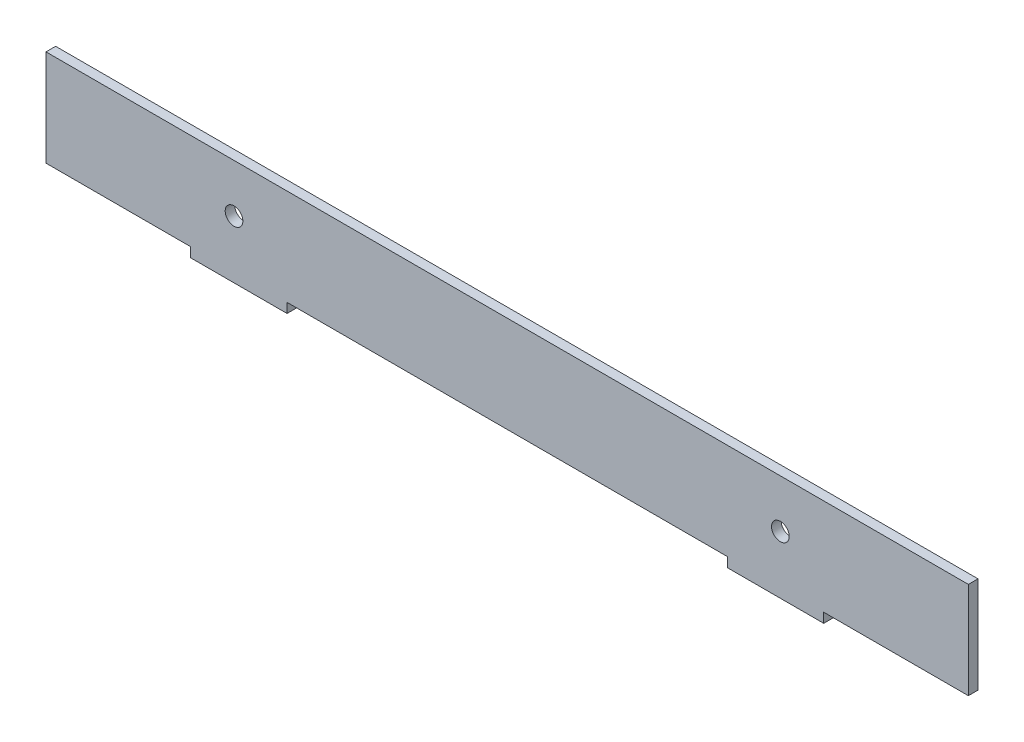
ISO-10303-21;
HEADER;
FILE_DESCRIPTION(('STEP AP214'),'2;1');
FILE_NAME('part.step','',(''),(''),'','','');
FILE_SCHEMA(('AUTOMOTIVE_DESIGN { 1 0 10303 214 1 1 1 1 }'));
ENDSEC;
DATA;
#1=APPLICATION_CONTEXT('core data for automotive mechanical design processes');
#2=APPLICATION_PROTOCOL_DEFINITION('international standard','automotive_design',2000,#1);
#3=PRODUCT_CONTEXT('',#1,'mechanical');
#4=PRODUCT('Part','Part','',(#3));
#5=PRODUCT_RELATED_PRODUCT_CATEGORY('part','',(#4));
#6=PRODUCT_DEFINITION_FORMATION('','',#4);
#7=PRODUCT_DEFINITION_CONTEXT('part definition',#1,'design');
#8=PRODUCT_DEFINITION('design','',#6,#7);
#9=PRODUCT_DEFINITION_SHAPE('','',#8);
#10=(LENGTH_UNIT() NAMED_UNIT(*) SI_UNIT(.MILLI.,.METRE.));
#11=(NAMED_UNIT(*) PLANE_ANGLE_UNIT() SI_UNIT($,.RADIAN.));
#12=(NAMED_UNIT(*) SI_UNIT($,.STERADIAN.) SOLID_ANGLE_UNIT());
#13=UNCERTAINTY_MEASURE_WITH_UNIT(LENGTH_MEASURE(1.E-05),#10,'distance_accuracy_value','');
#14=(GEOMETRIC_REPRESENTATION_CONTEXT(3) GLOBAL_UNCERTAINTY_ASSIGNED_CONTEXT((#13)) GLOBAL_UNIT_ASSIGNED_CONTEXT((#10,
#11,#12)) REPRESENTATION_CONTEXT('',''));
#15=CARTESIAN_POINT('',(0.,0.,0.));
#16=DIRECTION('',(0.,0.,1.));
#17=DIRECTION('',(1.,0.,0.));
#18=AXIS2_PLACEMENT_3D('',#15,#16,#17);
#19=CARTESIAN_POINT('',(0.,0.,-1.5));
#20=DIRECTION('',(0.,0.,-1.));
#21=DIRECTION('',(-1.,0.,0.));
#22=AXIS2_PLACEMENT_3D('',#19,#20,#21);
#23=PLANE('',#22);
#24=DIRECTION('',(0.,1.,0.));
#25=VECTOR('',#24,1.);
#26=CARTESIAN_POINT('',(143.5,-15.,-1.5));
#27=LINE('',#26,#25);
#28=CARTESIAN_POINT('',(143.5,-15.,-1.5));
#29=VERTEX_POINT('',#28);
#30=CARTESIAN_POINT('',(143.5,15.,-1.5));
#31=VERTEX_POINT('',#30);
#32=EDGE_CURVE('E154',#29,#31,#27,.T.);
#33=ORIENTED_EDGE('',*,*,#32,.F.);
#34=DIRECTION('',(1.,0.,0.));
#35=VECTOR('',#34,1.);
#36=CARTESIAN_POINT('',(98.5,-15.,-1.5));
#37=LINE('',#36,#35);
#38=CARTESIAN_POINT('',(98.5,-15.,-1.5));
#39=VERTEX_POINT('',#38);
#40=EDGE_CURVE('E97',#39,#29,#37,.T.);
#41=ORIENTED_EDGE('',*,*,#40,.F.);
#42=DIRECTION('',(0.,1.,0.));
#43=VECTOR('',#42,1.);
#44=CARTESIAN_POINT('',(98.5,-15.,-1.5));
#45=LINE('',#44,#43);
#46=CARTESIAN_POINT('',(98.5,-18.,-1.5));
#47=VERTEX_POINT('',#46);
#48=EDGE_CURVE('E91',#47,#39,#45,.T.);
#49=ORIENTED_EDGE('',*,*,#48,.F.);
#50=DIRECTION('',(1.,0.,0.));
#51=VECTOR('',#50,1.);
#52=CARTESIAN_POINT('',(98.5,-18.,-1.5));
#53=LINE('',#52,#51);
#54=CARTESIAN_POINT('',(68.5,-18.,-1.5));
#55=VERTEX_POINT('',#54);
#56=EDGE_CURVE('E144',#55,#47,#53,.T.);
#57=ORIENTED_EDGE('',*,*,#56,.F.);
#58=DIRECTION('',(0.,-1.,0.));
#59=VECTOR('',#58,1.);
#60=CARTESIAN_POINT('',(68.5,-15.,-1.5));
#61=LINE('',#60,#59);
#62=CARTESIAN_POINT('',(68.5,-15.,-1.5));
#63=VERTEX_POINT('',#62);
#64=EDGE_CURVE('E172',#63,#55,#61,.T.);
#65=ORIENTED_EDGE('',*,*,#64,.F.);
#66=DIRECTION('',(1.,0.,0.));
#67=VECTOR('',#66,1.);
#68=CARTESIAN_POINT('',(-68.5,-15.,-1.5));
#69=LINE('',#68,#67);
#70=CARTESIAN_POINT('',(-68.5,-15.,-1.5));
#71=VERTEX_POINT('',#70);
#72=EDGE_CURVE('E170',#71,#63,#69,.T.);
#73=ORIENTED_EDGE('',*,*,#72,.F.);
#74=DIRECTION('',(0.,1.,0.));
#75=VECTOR('',#74,1.);
#76=CARTESIAN_POINT('',(-68.5,-15.,-1.5));
#77=LINE('',#76,#75);
#78=CARTESIAN_POINT('',(-68.5,-18.,-1.5));
#79=VERTEX_POINT('',#78);
#80=EDGE_CURVE('E168',#79,#71,#77,.T.);
#81=ORIENTED_EDGE('',*,*,#80,.F.);
#82=DIRECTION('',(1.,0.,0.));
#83=VECTOR('',#82,1.);
#84=CARTESIAN_POINT('',(-98.5,-18.,-1.5));
#85=LINE('',#84,#83);
#86=CARTESIAN_POINT('',(-98.5,-18.,-1.5));
#87=VERTEX_POINT('',#86);
#88=EDGE_CURVE('E166',#87,#79,#85,.T.);
#89=ORIENTED_EDGE('',*,*,#88,.F.);
#90=DIRECTION('',(0.,-1.,0.));
#91=VECTOR('',#90,1.);
#92=CARTESIAN_POINT('',(-98.5,-15.,-1.5));
#93=LINE('',#92,#91);
#94=CARTESIAN_POINT('',(-98.5,-15.,-1.5));
#95=VERTEX_POINT('',#94);
#96=EDGE_CURVE('E164',#95,#87,#93,.T.);
#97=ORIENTED_EDGE('',*,*,#96,.F.);
#98=DIRECTION('',(1.,0.,0.));
#99=VECTOR('',#98,1.);
#100=CARTESIAN_POINT('',(-143.5,-15.,-1.5));
#101=LINE('',#100,#99);
#102=CARTESIAN_POINT('',(-143.5,-15.,-1.5));
#103=VERTEX_POINT('',#102);
#104=EDGE_CURVE('E162',#103,#95,#101,.T.);
#105=ORIENTED_EDGE('',*,*,#104,.F.);
#106=DIRECTION('',(0.,-1.,0.));
#107=VECTOR('',#106,1.);
#108=CARTESIAN_POINT('',(-143.5,-15.,-1.5));
#109=LINE('',#108,#107);
#110=CARTESIAN_POINT('',(-143.5,15.,-1.5));
#111=VERTEX_POINT('',#110);
#112=EDGE_CURVE('E160',#111,#103,#109,.T.);
#113=ORIENTED_EDGE('',*,*,#112,.F.);
#114=DIRECTION('',(-1.,0.,0.));
#115=VECTOR('',#114,1.);
#116=CARTESIAN_POINT('',(-143.5,15.,-1.5));
#117=LINE('',#116,#115);
#118=EDGE_CURVE('E157',#31,#111,#117,.T.);
#119=ORIENTED_EDGE('',*,*,#118,.F.);
#120=EDGE_LOOP('',(#33,#41,#49,#57,#65,#73,#81,#89,#97,#105,#113,#119));
#121=FACE_BOUND('',#120,.T.);
#122=CARTESIAN_POINT('',(85.,0.,-1.5));
#123=DIRECTION('',(0.,0.,1.));
#124=DIRECTION('',(1.,0.,0.));
#125=AXIS2_PLACEMENT_3D('',#122,#123,#124);
#126=CIRCLE('',#125,2.74999999999999);
#127=CARTESIAN_POINT('',(87.75,0.,-1.5));
#128=VERTEX_POINT('',#127);
#129=EDGE_CURVE('E158',#128,#128,#126,.T.);
#130=ORIENTED_EDGE('',*,*,#129,.T.);
#131=EDGE_LOOP('',(#130));
#132=FACE_BOUND('',#131,.T.);
#133=CARTESIAN_POINT('',(-85.,0.,-1.5));
#134=DIRECTION('',(0.,0.,1.));
#135=DIRECTION('',(1.,0.,0.));
#136=AXIS2_PLACEMENT_3D('',#133,#134,#135);
#137=CIRCLE('',#136,2.74999999999999);
#138=CARTESIAN_POINT('',(-82.25,0.,-1.5));
#139=VERTEX_POINT('',#138);
#140=EDGE_CURVE('E274',#139,#139,#137,.T.);
#141=ORIENTED_EDGE('',*,*,#140,.T.);
#142=EDGE_LOOP('',(#141));
#143=FACE_BOUND('',#142,.T.);
#144=ADVANCED_FACE('F33',(#121,#132,#143),#23,.T.);
#145=CARTESIAN_POINT('',(143.5,-15.,1.5));
#146=DIRECTION('',(-1.,0.,0.));
#147=DIRECTION('',(0.,0.,1.));
#148=AXIS2_PLACEMENT_3D('',#145,#146,#147);
#149=PLANE('',#148);
#150=ORIENTED_EDGE('',*,*,#32,.T.);
#151=DIRECTION('',(0.,0.,-1.));
#152=VECTOR('',#151,1.);
#153=CARTESIAN_POINT('',(143.5,15.,1.5));
#154=LINE('',#153,#152);
#155=CARTESIAN_POINT('',(143.5,15.,1.5));
#156=VERTEX_POINT('',#155);
#157=EDGE_CURVE('E11',#156,#31,#154,.T.);
#158=ORIENTED_EDGE('',*,*,#157,.F.);
#159=DIRECTION('',(0.,1.,0.));
#160=VECTOR('',#159,1.);
#161=CARTESIAN_POINT('',(143.5,-15.,1.5));
#162=LINE('',#161,#160);
#163=CARTESIAN_POINT('',(143.5,-15.,1.5));
#164=VERTEX_POINT('',#163);
#165=EDGE_CURVE('E177',#164,#156,#162,.T.);
#166=ORIENTED_EDGE('',*,*,#165,.F.);
#167=DIRECTION('',(0.,0.,-1.));
#168=VECTOR('',#167,1.);
#169=CARTESIAN_POINT('',(143.5,-15.,1.5));
#170=LINE('',#169,#168);
#171=EDGE_CURVE('E150',#164,#29,#170,.T.);
#172=ORIENTED_EDGE('',*,*,#171,.T.);
#173=EDGE_LOOP('',(#150,#158,#166,#172));
#174=FACE_BOUND('',#173,.T.);
#175=ADVANCED_FACE('F35',(#174),#149,.F.);
#176=CARTESIAN_POINT('',(-143.5,15.,1.5));
#177=DIRECTION('',(0.,-1.,0.));
#178=DIRECTION('',(1.,0.,0.));
#179=AXIS2_PLACEMENT_3D('',#176,#177,#178);
#180=PLANE('',#179);
#181=ORIENTED_EDGE('',*,*,#118,.T.);
#182=DIRECTION('',(0.,0.,-1.));
#183=VECTOR('',#182,1.);
#184=CARTESIAN_POINT('',(-143.5,15.,1.5));
#185=LINE('',#184,#183);
#186=CARTESIAN_POINT('',(-143.5,15.,1.5));
#187=VERTEX_POINT('',#186);
#188=EDGE_CURVE('E42',#187,#111,#185,.T.);
#189=ORIENTED_EDGE('',*,*,#188,.F.);
#190=DIRECTION('',(-1.,0.,0.));
#191=VECTOR('',#190,1.);
#192=CARTESIAN_POINT('',(-143.5,15.,1.5));
#193=LINE('',#192,#191);
#194=EDGE_CURVE('E105',#156,#187,#193,.T.);
#195=ORIENTED_EDGE('',*,*,#194,.F.);
#196=ORIENTED_EDGE('',*,*,#157,.T.);
#197=EDGE_LOOP('',(#181,#189,#195,#196));
#198=FACE_BOUND('',#197,.T.);
#199=ADVANCED_FACE('F261',(#198),#180,.F.);
#200=CARTESIAN_POINT('',(-143.5,-15.,1.5));
#201=DIRECTION('',(1.,0.,0.));
#202=DIRECTION('',(0.,0.,-1.));
#203=AXIS2_PLACEMENT_3D('',#200,#201,#202);
#204=PLANE('',#203);
#205=ORIENTED_EDGE('',*,*,#112,.T.);
#206=DIRECTION('',(0.,0.,-1.));
#207=VECTOR('',#206,1.);
#208=CARTESIAN_POINT('',(-143.5,-15.,1.5));
#209=LINE('',#208,#207);
#210=CARTESIAN_POINT('',(-143.5,-15.,1.5));
#211=VERTEX_POINT('',#210);
#212=EDGE_CURVE('E196',#211,#103,#209,.T.);
#213=ORIENTED_EDGE('',*,*,#212,.F.);
#214=DIRECTION('',(0.,-1.,0.));
#215=VECTOR('',#214,1.);
#216=CARTESIAN_POINT('',(-143.5,-15.,1.5));
#217=LINE('',#216,#215);
#218=EDGE_CURVE('E204',#187,#211,#217,.T.);
#219=ORIENTED_EDGE('',*,*,#218,.F.);
#220=ORIENTED_EDGE('',*,*,#188,.T.);
#221=EDGE_LOOP('',(#205,#213,#219,#220));
#222=FACE_BOUND('',#221,.T.);
#223=ADVANCED_FACE('F202',(#222),#204,.F.);
#224=CARTESIAN_POINT('',(-143.5,-15.,1.5));
#225=DIRECTION('',(0.,1.,0.));
#226=DIRECTION('',(-1.,0.,0.));
#227=AXIS2_PLACEMENT_3D('',#224,#225,#226);
#228=PLANE('',#227);
#229=ORIENTED_EDGE('',*,*,#104,.T.);
#230=DIRECTION('',(0.,0.,-1.));
#231=VECTOR('',#230,1.);
#232=CARTESIAN_POINT('',(-98.5,-15.,1.5));
#233=LINE('',#232,#231);
#234=CARTESIAN_POINT('',(-98.5,-15.,1.5));
#235=VERTEX_POINT('',#234);
#236=EDGE_CURVE('E193',#235,#95,#233,.T.);
#237=ORIENTED_EDGE('',*,*,#236,.F.);
#238=DIRECTION('',(1.,0.,0.));
#239=VECTOR('',#238,1.);
#240=CARTESIAN_POINT('',(-143.5,-15.,1.5));
#241=LINE('',#240,#239);
#242=EDGE_CURVE('E222',#211,#235,#241,.T.);
#243=ORIENTED_EDGE('',*,*,#242,.F.);
#244=ORIENTED_EDGE('',*,*,#212,.T.);
#245=EDGE_LOOP('',(#229,#237,#243,#244));
#246=FACE_BOUND('',#245,.T.);
#247=ADVANCED_FACE('F213',(#246),#228,.F.);
#248=CARTESIAN_POINT('',(-98.5,-15.,1.5));
#249=DIRECTION('',(1.,0.,0.));
#250=DIRECTION('',(0.,0.,-1.));
#251=AXIS2_PLACEMENT_3D('',#248,#249,#250);
#252=PLANE('',#251);
#253=ORIENTED_EDGE('',*,*,#96,.T.);
#254=DIRECTION('',(0.,0.,-1.));
#255=VECTOR('',#254,1.);
#256=CARTESIAN_POINT('',(-98.5,-18.,1.5));
#257=LINE('',#256,#255);
#258=CARTESIAN_POINT('',(-98.5,-18.,1.5));
#259=VERTEX_POINT('',#258);
#260=EDGE_CURVE('E190',#259,#87,#257,.T.);
#261=ORIENTED_EDGE('',*,*,#260,.F.);
#262=DIRECTION('',(0.,-1.,0.));
#263=VECTOR('',#262,1.);
#264=CARTESIAN_POINT('',(-98.5,-15.,1.5));
#265=LINE('',#264,#263);
#266=EDGE_CURVE('E219',#235,#259,#265,.T.);
#267=ORIENTED_EDGE('',*,*,#266,.F.);
#268=ORIENTED_EDGE('',*,*,#236,.T.);
#269=EDGE_LOOP('',(#253,#261,#267,#268));
#270=FACE_BOUND('',#269,.T.);
#271=ADVANCED_FACE('F217',(#270),#252,.F.);
#272=CARTESIAN_POINT('',(-98.5,-18.,1.5));
#273=DIRECTION('',(0.,1.,0.));
#274=DIRECTION('',(-1.,0.,0.));
#275=AXIS2_PLACEMENT_3D('',#272,#273,#274);
#276=PLANE('',#275);
#277=ORIENTED_EDGE('',*,*,#88,.T.);
#278=DIRECTION('',(0.,0.,-1.));
#279=VECTOR('',#278,1.);
#280=CARTESIAN_POINT('',(-68.5,-18.,1.5));
#281=LINE('',#280,#279);
#282=CARTESIAN_POINT('',(-68.5,-18.,1.5));
#283=VERTEX_POINT('',#282);
#284=EDGE_CURVE('E187',#283,#79,#281,.T.);
#285=ORIENTED_EDGE('',*,*,#284,.F.);
#286=DIRECTION('',(1.,0.,0.));
#287=VECTOR('',#286,1.);
#288=CARTESIAN_POINT('',(-98.5,-18.,1.5));
#289=LINE('',#288,#287);
#290=EDGE_CURVE('E221',#259,#283,#289,.T.);
#291=ORIENTED_EDGE('',*,*,#290,.F.);
#292=ORIENTED_EDGE('',*,*,#260,.T.);
#293=EDGE_LOOP('',(#277,#285,#291,#292));
#294=FACE_BOUND('',#293,.T.);
#295=ADVANCED_FACE('F344',(#294),#276,.F.);
#296=CARTESIAN_POINT('',(-68.5,-15.,1.5));
#297=DIRECTION('',(-1.,0.,0.));
#298=DIRECTION('',(0.,0.,1.));
#299=AXIS2_PLACEMENT_3D('',#296,#297,#298);
#300=PLANE('',#299);
#301=ORIENTED_EDGE('',*,*,#80,.T.);
#302=DIRECTION('',(0.,0.,-1.));
#303=VECTOR('',#302,1.);
#304=CARTESIAN_POINT('',(-68.5,-15.,1.5));
#305=LINE('',#304,#303);
#306=CARTESIAN_POINT('',(-68.5,-15.,1.5));
#307=VERTEX_POINT('',#306);
#308=EDGE_CURVE('E184',#307,#71,#305,.T.);
#309=ORIENTED_EDGE('',*,*,#308,.F.);
#310=DIRECTION('',(0.,1.,0.));
#311=VECTOR('',#310,1.);
#312=CARTESIAN_POINT('',(-68.5,-15.,1.5));
#313=LINE('',#312,#311);
#314=EDGE_CURVE('E224',#283,#307,#313,.T.);
#315=ORIENTED_EDGE('',*,*,#314,.F.);
#316=ORIENTED_EDGE('',*,*,#284,.T.);
#317=EDGE_LOOP('',(#301,#309,#315,#316));
#318=FACE_BOUND('',#317,.T.);
#319=ADVANCED_FACE('F336',(#318),#300,.F.);
#320=CARTESIAN_POINT('',(-68.5,-15.,1.5));
#321=DIRECTION('',(0.,1.,0.));
#322=DIRECTION('',(-1.,0.,0.));
#323=AXIS2_PLACEMENT_3D('',#320,#321,#322);
#324=PLANE('',#323);
#325=ORIENTED_EDGE('',*,*,#72,.T.);
#326=DIRECTION('',(0.,0.,-1.));
#327=VECTOR('',#326,1.);
#328=CARTESIAN_POINT('',(68.5,-15.,1.5));
#329=LINE('',#328,#327);
#330=CARTESIAN_POINT('',(68.5,-15.,1.5));
#331=VERTEX_POINT('',#330);
#332=EDGE_CURVE('E181',#331,#63,#329,.T.);
#333=ORIENTED_EDGE('',*,*,#332,.F.);
#334=DIRECTION('',(1.,0.,0.));
#335=VECTOR('',#334,1.);
#336=CARTESIAN_POINT('',(-68.5,-15.,1.5));
#337=LINE('',#336,#335);
#338=EDGE_CURVE('E230',#307,#331,#337,.T.);
#339=ORIENTED_EDGE('',*,*,#338,.F.);
#340=ORIENTED_EDGE('',*,*,#308,.T.);
#341=EDGE_LOOP('',(#325,#333,#339,#340));
#342=FACE_BOUND('',#341,.T.);
#343=ADVANCED_FACE('F236',(#342),#324,.F.);
#344=CARTESIAN_POINT('',(68.5,-15.,1.5));
#345=DIRECTION('',(1.,0.,0.));
#346=DIRECTION('',(0.,0.,-1.));
#347=AXIS2_PLACEMENT_3D('',#344,#345,#346);
#348=PLANE('',#347);
#349=ORIENTED_EDGE('',*,*,#64,.T.);
#350=DIRECTION('',(0.,0.,-1.));
#351=VECTOR('',#350,1.);
#352=CARTESIAN_POINT('',(68.5,-18.,1.5));
#353=LINE('',#352,#351);
#354=CARTESIAN_POINT('',(68.5,-18.,1.5));
#355=VERTEX_POINT('',#354);
#356=EDGE_CURVE('E145',#355,#55,#353,.T.);
#357=ORIENTED_EDGE('',*,*,#356,.F.);
#358=DIRECTION('',(0.,-1.,0.));
#359=VECTOR('',#358,1.);
#360=CARTESIAN_POINT('',(68.5,-15.,1.5));
#361=LINE('',#360,#359);
#362=EDGE_CURVE('E136',#331,#355,#361,.T.);
#363=ORIENTED_EDGE('',*,*,#362,.F.);
#364=ORIENTED_EDGE('',*,*,#332,.T.);
#365=EDGE_LOOP('',(#349,#357,#363,#364));
#366=FACE_BOUND('',#365,.T.);
#367=ADVANCED_FACE('F240',(#366),#348,.F.);
#368=CARTESIAN_POINT('',(98.5,-18.,1.5));
#369=DIRECTION('',(0.,1.,0.));
#370=DIRECTION('',(-1.,0.,0.));
#371=AXIS2_PLACEMENT_3D('',#368,#369,#370);
#372=PLANE('',#371);
#373=ORIENTED_EDGE('',*,*,#56,.T.);
#374=DIRECTION('',(0.,0.,-1.));
#375=VECTOR('',#374,1.);
#376=CARTESIAN_POINT('',(98.5,-18.,1.5));
#377=LINE('',#376,#375);
#378=CARTESIAN_POINT('',(98.5,-18.,1.5));
#379=VERTEX_POINT('',#378);
#380=EDGE_CURVE('E141',#379,#47,#377,.T.);
#381=ORIENTED_EDGE('',*,*,#380,.F.);
#382=DIRECTION('',(1.,0.,0.));
#383=VECTOR('',#382,1.);
#384=CARTESIAN_POINT('',(98.5,-18.,1.5));
#385=LINE('',#384,#383);
#386=EDGE_CURVE('E130',#355,#379,#385,.T.);
#387=ORIENTED_EDGE('',*,*,#386,.F.);
#388=ORIENTED_EDGE('',*,*,#356,.T.);
#389=EDGE_LOOP('',(#373,#381,#387,#388));
#390=FACE_BOUND('',#389,.T.);
#391=ADVANCED_FACE('F142',(#390),#372,.F.);
#392=CARTESIAN_POINT('',(98.5,-15.,1.5));
#393=DIRECTION('',(-1.,0.,0.));
#394=DIRECTION('',(0.,0.,1.));
#395=AXIS2_PLACEMENT_3D('',#392,#393,#394);
#396=PLANE('',#395);
#397=ORIENTED_EDGE('',*,*,#48,.T.);
#398=DIRECTION('',(0.,0.,-1.));
#399=VECTOR('',#398,1.);
#400=CARTESIAN_POINT('',(98.5,-15.,1.5));
#401=LINE('',#400,#399);
#402=CARTESIAN_POINT('',(98.5,-15.,1.5));
#403=VERTEX_POINT('',#402);
#404=EDGE_CURVE('E146',#403,#39,#401,.T.);
#405=ORIENTED_EDGE('',*,*,#404,.F.);
#406=DIRECTION('',(0.,1.,0.));
#407=VECTOR('',#406,1.);
#408=CARTESIAN_POINT('',(98.5,-15.,1.5));
#409=LINE('',#408,#407);
#410=EDGE_CURVE('E134',#379,#403,#409,.T.);
#411=ORIENTED_EDGE('',*,*,#410,.F.);
#412=ORIENTED_EDGE('',*,*,#380,.T.);
#413=EDGE_LOOP('',(#397,#405,#411,#412));
#414=FACE_BOUND('',#413,.T.);
#415=ADVANCED_FACE('F148',(#414),#396,.F.);
#416=CARTESIAN_POINT('',(98.5,-15.,1.5));
#417=DIRECTION('',(0.,1.,0.));
#418=DIRECTION('',(-1.,0.,0.));
#419=AXIS2_PLACEMENT_3D('',#416,#417,#418);
#420=PLANE('',#419);
#421=ORIENTED_EDGE('',*,*,#40,.T.);
#422=ORIENTED_EDGE('',*,*,#171,.F.);
#423=DIRECTION('',(1.,0.,0.));
#424=VECTOR('',#423,1.);
#425=CARTESIAN_POINT('',(98.5,-15.,1.5));
#426=LINE('',#425,#424);
#427=EDGE_CURVE('E50',#403,#164,#426,.T.);
#428=ORIENTED_EDGE('',*,*,#427,.F.);
#429=ORIENTED_EDGE('',*,*,#404,.T.);
#430=EDGE_LOOP('',(#421,#422,#428,#429));
#431=FACE_BOUND('',#430,.T.);
#432=ADVANCED_FACE('F244',(#431),#420,.F.);
#433=CARTESIAN_POINT('',(0.,0.,1.5));
#434=DIRECTION('',(0.,0.,-1.));
#435=DIRECTION('',(-1.,0.,0.));
#436=AXIS2_PLACEMENT_3D('',#433,#434,#435);
#437=PLANE('',#436);
#438=CARTESIAN_POINT('',(-85.,0.,1.5));
#439=DIRECTION('',(0.,0.,1.));
#440=DIRECTION('',(1.,0.,0.));
#441=AXIS2_PLACEMENT_3D('',#438,#439,#440);
#442=CIRCLE('',#441,2.74999999999999);
#443=CARTESIAN_POINT('',(-82.25,0.,1.5));
#444=VERTEX_POINT('',#443);
#445=EDGE_CURVE('E277',#444,#444,#442,.T.);
#446=ORIENTED_EDGE('',*,*,#445,.F.);
#447=EDGE_LOOP('',(#446));
#448=FACE_BOUND('',#447,.T.);
#449=CARTESIAN_POINT('',(85.,0.,1.5));
#450=DIRECTION('',(0.,0.,1.));
#451=DIRECTION('',(1.,0.,0.));
#452=AXIS2_PLACEMENT_3D('',#449,#450,#451);
#453=CIRCLE('',#452,2.74999999999999);
#454=CARTESIAN_POINT('',(87.75,0.,1.5));
#455=VERTEX_POINT('',#454);
#456=EDGE_CURVE('E279',#455,#455,#453,.T.);
#457=ORIENTED_EDGE('',*,*,#456,.F.);
#458=EDGE_LOOP('',(#457));
#459=FACE_BOUND('',#458,.T.);
#460=ORIENTED_EDGE('',*,*,#165,.T.);
#461=ORIENTED_EDGE('',*,*,#194,.T.);
#462=ORIENTED_EDGE('',*,*,#218,.T.);
#463=ORIENTED_EDGE('',*,*,#242,.T.);
#464=ORIENTED_EDGE('',*,*,#266,.T.);
#465=ORIENTED_EDGE('',*,*,#290,.T.);
#466=ORIENTED_EDGE('',*,*,#314,.T.);
#467=ORIENTED_EDGE('',*,*,#338,.T.);
#468=ORIENTED_EDGE('',*,*,#362,.T.);
#469=ORIENTED_EDGE('',*,*,#386,.T.);
#470=ORIENTED_EDGE('',*,*,#410,.T.);
#471=ORIENTED_EDGE('',*,*,#427,.T.);
#472=EDGE_LOOP('',(#460,#461,#462,#463,#464,#465,#466,#467,#468,#469,#470,#471));
#473=FACE_BOUND('',#472,.T.);
#474=ADVANCED_FACE('F132',(#448,#459,#473),#437,.F.);
#475=CARTESIAN_POINT('',(85.,0.,1.5));
#476=DIRECTION('',(0.,0.,1.));
#477=DIRECTION('',(1.,0.,0.));
#478=AXIS2_PLACEMENT_3D('',#475,#476,#477);
#479=CYLINDRICAL_SURFACE('',#478,2.74999999999999);
#480=ORIENTED_EDGE('',*,*,#129,.F.);
#481=EDGE_LOOP('',(#480));
#482=FACE_BOUND('',#481,.T.);
#483=ORIENTED_EDGE('',*,*,#456,.T.);
#484=EDGE_LOOP('',(#483));
#485=FACE_BOUND('',#484,.T.);
#486=ADVANCED_FACE('F252',(#482,#485),#479,.F.);
#487=CARTESIAN_POINT('',(-85.,0.,1.5));
#488=DIRECTION('',(0.,0.,1.));
#489=DIRECTION('',(1.,0.,0.));
#490=AXIS2_PLACEMENT_3D('',#487,#488,#489);
#491=CYLINDRICAL_SURFACE('',#490,2.74999999999999);
#492=ORIENTED_EDGE('',*,*,#140,.F.);
#493=EDGE_LOOP('',(#492));
#494=FACE_BOUND('',#493,.T.);
#495=ORIENTED_EDGE('',*,*,#445,.T.);
#496=EDGE_LOOP('',(#495));
#497=FACE_BOUND('',#496,.T.);
#498=ADVANCED_FACE('F265',(#494,#497),#491,.F.);
#499=CLOSED_SHELL('',(#144,#175,#199,#223,#247,#271,#295,#319,#343,#367,#391,#415,#432,#474,
#486,#498));
#500=MANIFOLD_SOLID_BREP('B2',#499);
#501=ADVANCED_BREP_SHAPE_REPRESENTATION('',(#18,#500),#14);
#502=SHAPE_DEFINITION_REPRESENTATION(#9,#501);
ENDSEC;
END-ISO-10303-21;
